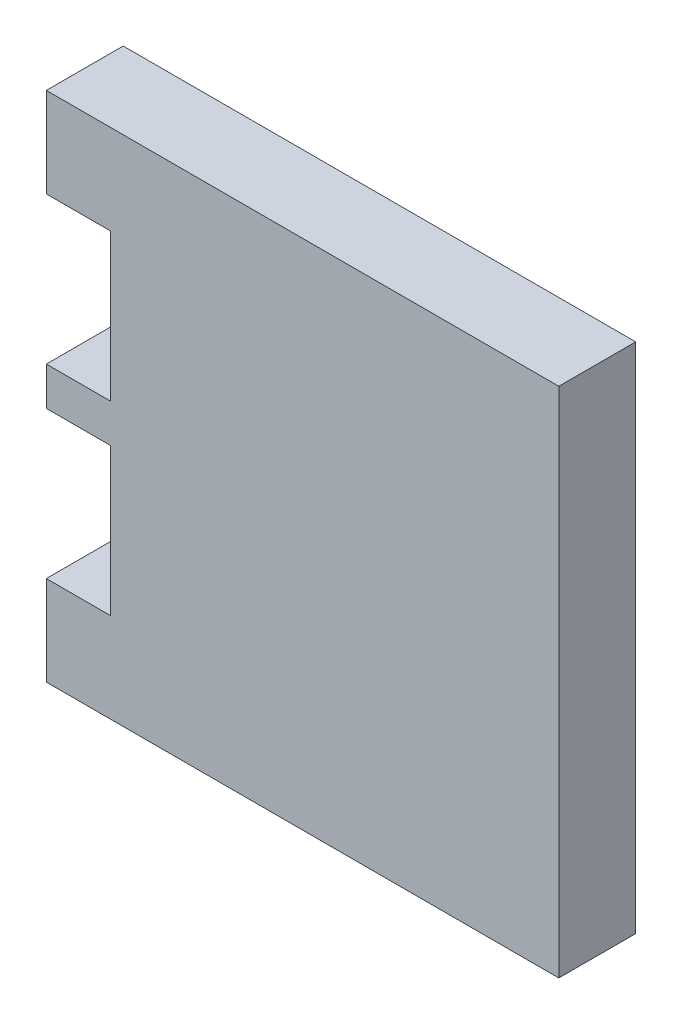
ISO-10303-21;
HEADER;
FILE_DESCRIPTION(('STEP AP214'),'2;1');
FILE_NAME('part.step','',(''),(''),'','','');
FILE_SCHEMA(('AUTOMOTIVE_DESIGN { 1 0 10303 214 1 1 1 1 }'));
ENDSEC;
DATA;
#1=APPLICATION_CONTEXT('core data for automotive mechanical design processes');
#2=APPLICATION_PROTOCOL_DEFINITION('international standard','automotive_design',2000,#1);
#3=PRODUCT_CONTEXT('',#1,'mechanical');
#4=PRODUCT('Part','Part','',(#3));
#5=PRODUCT_RELATED_PRODUCT_CATEGORY('part','',(#4));
#6=PRODUCT_DEFINITION_FORMATION('','',#4);
#7=PRODUCT_DEFINITION_CONTEXT('part definition',#1,'design');
#8=PRODUCT_DEFINITION('design','',#6,#7);
#9=PRODUCT_DEFINITION_SHAPE('','',#8);
#10=(LENGTH_UNIT() NAMED_UNIT(*) SI_UNIT(.MILLI.,.METRE.));
#11=(NAMED_UNIT(*) PLANE_ANGLE_UNIT() SI_UNIT($,.RADIAN.));
#12=(NAMED_UNIT(*) SI_UNIT($,.STERADIAN.) SOLID_ANGLE_UNIT());
#13=UNCERTAINTY_MEASURE_WITH_UNIT(LENGTH_MEASURE(1.E-05),#10,'distance_accuracy_value','');
#14=(GEOMETRIC_REPRESENTATION_CONTEXT(3) GLOBAL_UNCERTAINTY_ASSIGNED_CONTEXT((#13)) GLOBAL_UNIT_ASSIGNED_CONTEXT((#10,
#11,#12)) REPRESENTATION_CONTEXT('',''));
#15=CARTESIAN_POINT('',(0.,0.,0.));
#16=DIRECTION('',(0.,0.,1.));
#17=DIRECTION('',(1.,0.,0.));
#18=AXIS2_PLACEMENT_3D('',#15,#16,#17);
#19=CARTESIAN_POINT('',(-25.7556270096463,-10.1929260450161,6.));
#20=DIRECTION('',(0.,1.,0.));
#21=DIRECTION('',(0.,0.,1.));
#22=AXIS2_PLACEMENT_3D('',#19,#20,#21);
#23=PLANE('',#22);
#24=DIRECTION('',(0.,0.,1.));
#25=VECTOR('',#24,1.);
#26=CARTESIAN_POINT('',(14.2443729903537,-10.1929260450161,0.));
#27=LINE('',#26,#25);
#28=CARTESIAN_POINT('',(14.2443729903537,-10.1929260450161,0.));
#29=VERTEX_POINT('',#28);
#30=CARTESIAN_POINT('',(14.2443729903537,-10.1929260450161,6.));
#31=VERTEX_POINT('',#30);
#32=EDGE_CURVE('E124',#29,#31,#27,.T.);
#33=ORIENTED_EDGE('',*,*,#32,.T.);
#34=DIRECTION('',(1.,0.,0.));
#35=VECTOR('',#34,1.);
#36=CARTESIAN_POINT('',(-25.7556270096463,-10.1929260450161,6.));
#37=LINE('',#36,#35);
#38=CARTESIAN_POINT('',(-25.7556270096463,-10.1929260450161,6.));
#39=VERTEX_POINT('',#38);
#40=EDGE_CURVE('E150',#39,#31,#37,.T.);
#41=ORIENTED_EDGE('',*,*,#40,.F.);
#42=DIRECTION('',(0.,0.,-1.));
#43=VECTOR('',#42,1.);
#44=CARTESIAN_POINT('',(-25.7556270096463,-10.1929260450161,6.));
#45=LINE('',#44,#43);
#46=CARTESIAN_POINT('',(-25.7556270096463,-10.1929260450161,0.));
#47=VERTEX_POINT('',#46);
#48=EDGE_CURVE('E40',#39,#47,#45,.T.);
#49=ORIENTED_EDGE('',*,*,#48,.T.);
#50=DIRECTION('',(1.,0.,0.));
#51=VECTOR('',#50,1.);
#52=CARTESIAN_POINT('',(-25.7556270096463,-10.1929260450161,0.));
#53=LINE('',#52,#51);
#54=EDGE_CURVE('E143',#47,#29,#53,.T.);
#55=ORIENTED_EDGE('',*,*,#54,.T.);
#56=EDGE_LOOP('',(#33,#41,#49,#55));
#57=FACE_BOUND('',#56,.T.);
#58=ADVANCED_FACE('F33',(#57),#23,.F.);
#59=CARTESIAN_POINT('',(0.,0.,6.));
#60=DIRECTION('',(0.,0.,-1.));
#61=DIRECTION('',(-1.,0.,0.));
#62=AXIS2_PLACEMENT_3D('',#59,#60,#61);
#63=PLANE('',#62);
#64=ORIENTED_EDGE('',*,*,#40,.T.);
#65=DIRECTION('',(0.,-1.,0.));
#66=VECTOR('',#65,1.);
#67=CARTESIAN_POINT('',(14.2443729903537,29.8070739549839,6.));
#68=LINE('',#67,#66);
#69=CARTESIAN_POINT('',(14.2443729903537,29.8070739549839,6.));
#70=VERTEX_POINT('',#69);
#71=EDGE_CURVE('E126',#70,#31,#68,.T.);
#72=ORIENTED_EDGE('',*,*,#71,.F.);
#73=DIRECTION('',(1.,0.,0.));
#74=VECTOR('',#73,1.);
#75=CARTESIAN_POINT('',(-25.7556270096463,29.8070739549839,6.));
#76=LINE('',#75,#74);
#77=CARTESIAN_POINT('',(-25.7556270096463,29.8070739549839,6.));
#78=VERTEX_POINT('',#77);
#79=EDGE_CURVE('E134',#78,#70,#76,.T.);
#80=ORIENTED_EDGE('',*,*,#79,.F.);
#81=DIRECTION('',(0.,-1.,0.));
#82=VECTOR('',#81,1.);
#83=CARTESIAN_POINT('',(-25.7556270096463,29.8070739549839,6.));
#84=LINE('',#83,#82);
#85=CARTESIAN_POINT('',(-25.7556270096463,22.8070739549839,6.));
#86=VERTEX_POINT('',#85);
#87=EDGE_CURVE('E152',#78,#86,#84,.T.);
#88=ORIENTED_EDGE('',*,*,#87,.T.);
#89=DIRECTION('',(1.,0.,0.));
#90=VECTOR('',#89,1.);
#91=CARTESIAN_POINT('',(0.,22.8070739549839,6.));
#92=LINE('',#91,#90);
#93=CARTESIAN_POINT('',(-20.7556270096463,22.8070739549839,6.));
#94=VERTEX_POINT('',#93);
#95=EDGE_CURVE('E205',#86,#94,#92,.T.);
#96=ORIENTED_EDGE('',*,*,#95,.T.);
#97=DIRECTION('',(0.,-1.,0.));
#98=VECTOR('',#97,1.);
#99=CARTESIAN_POINT('',(-20.7556270096463,0.,6.));
#100=LINE('',#99,#98);
#101=CARTESIAN_POINT('',(-20.7556270096463,11.3070739549839,6.));
#102=VERTEX_POINT('',#101);
#103=EDGE_CURVE('E177',#94,#102,#100,.T.);
#104=ORIENTED_EDGE('',*,*,#103,.T.);
#105=DIRECTION('',(1.,0.,0.));
#106=VECTOR('',#105,1.);
#107=CARTESIAN_POINT('',(0.,11.3070739549839,6.));
#108=LINE('',#107,#106);
#109=CARTESIAN_POINT('',(-25.7556270096463,11.3070739549839,6.));
#110=VERTEX_POINT('',#109);
#111=EDGE_CURVE('E201',#110,#102,#108,.T.);
#112=ORIENTED_EDGE('',*,*,#111,.F.);
#113=CARTESIAN_POINT('',(-25.7556270096463,8.30707395498392,6.));
#114=VERTEX_POINT('',#113);
#115=EDGE_CURVE('E157',#110,#114,#84,.T.);
#116=ORIENTED_EDGE('',*,*,#115,.T.);
#117=DIRECTION('',(1.,0.,0.));
#118=VECTOR('',#117,1.);
#119=CARTESIAN_POINT('',(0.,8.30707395498392,6.));
#120=LINE('',#119,#118);
#121=CARTESIAN_POINT('',(-20.7556270096463,8.30707395498392,6.));
#122=VERTEX_POINT('',#121);
#123=EDGE_CURVE('E182',#114,#122,#120,.T.);
#124=ORIENTED_EDGE('',*,*,#123,.T.);
#125=DIRECTION('',(0.,-1.,0.));
#126=VECTOR('',#125,1.);
#127=CARTESIAN_POINT('',(-20.7556270096463,0.,6.));
#128=LINE('',#127,#126);
#129=CARTESIAN_POINT('',(-20.7556270096463,-3.19292604501608,6.));
#130=VERTEX_POINT('',#129);
#131=EDGE_CURVE('E135',#122,#130,#128,.T.);
#132=ORIENTED_EDGE('',*,*,#131,.T.);
#133=DIRECTION('',(1.,0.,0.));
#134=VECTOR('',#133,1.);
#135=CARTESIAN_POINT('',(0.,-3.19292604501608,6.));
#136=LINE('',#135,#134);
#137=CARTESIAN_POINT('',(-25.7556270096463,-3.19292604501608,6.));
#138=VERTEX_POINT('',#137);
#139=EDGE_CURVE('E178',#138,#130,#136,.T.);
#140=ORIENTED_EDGE('',*,*,#139,.F.);
#141=EDGE_CURVE('E158',#138,#39,#84,.T.);
#142=ORIENTED_EDGE('',*,*,#141,.T.);
#143=EDGE_LOOP('',(#64,#72,#80,#88,#96,#104,#112,#116,#124,#132,#140,#142));
#144=FACE_BOUND('',#143,.T.);
#145=ADVANCED_FACE('F215',(#144),#63,.F.);
#146=CARTESIAN_POINT('',(0.,0.,0.));
#147=DIRECTION('',(0.,0.,-1.));
#148=DIRECTION('',(-1.,0.,0.));
#149=AXIS2_PLACEMENT_3D('',#146,#147,#148);
#150=PLANE('',#149);
#151=DIRECTION('',(0.,-1.,0.));
#152=VECTOR('',#151,1.);
#153=CARTESIAN_POINT('',(14.2443729903537,29.8070739549839,0.));
#154=LINE('',#153,#152);
#155=CARTESIAN_POINT('',(14.2443729903537,29.8070739549839,0.));
#156=VERTEX_POINT('',#155);
#157=EDGE_CURVE('E47',#156,#29,#154,.T.);
#158=ORIENTED_EDGE('',*,*,#157,.T.);
#159=ORIENTED_EDGE('',*,*,#54,.F.);
#160=DIRECTION('',(0.,-1.,0.));
#161=VECTOR('',#160,1.);
#162=CARTESIAN_POINT('',(-25.7556270096463,29.8070739549839,0.));
#163=LINE('',#162,#161);
#164=CARTESIAN_POINT('',(-25.7556270096463,-3.19292604501608,0.));
#165=VERTEX_POINT('',#164);
#166=EDGE_CURVE('E142',#165,#47,#163,.T.);
#167=ORIENTED_EDGE('',*,*,#166,.F.);
#168=DIRECTION('',(1.,0.,0.));
#169=VECTOR('',#168,1.);
#170=CARTESIAN_POINT('',(0.,-3.19292604501608,0.));
#171=LINE('',#170,#169);
#172=CARTESIAN_POINT('',(-20.7556270096463,-3.19292604501608,0.));
#173=VERTEX_POINT('',#172);
#174=EDGE_CURVE('E171',#165,#173,#171,.T.);
#175=ORIENTED_EDGE('',*,*,#174,.T.);
#176=DIRECTION('',(0.,-1.,0.));
#177=VECTOR('',#176,1.);
#178=CARTESIAN_POINT('',(-20.7556270096463,0.,0.));
#179=LINE('',#178,#177);
#180=CARTESIAN_POINT('',(-20.7556270096463,8.30707395498392,0.));
#181=VERTEX_POINT('',#180);
#182=EDGE_CURVE('E181',#181,#173,#179,.T.);
#183=ORIENTED_EDGE('',*,*,#182,.F.);
#184=DIRECTION('',(1.,0.,0.));
#185=VECTOR('',#184,1.);
#186=CARTESIAN_POINT('',(0.,8.30707395498392,0.));
#187=LINE('',#186,#185);
#188=CARTESIAN_POINT('',(-25.7556270096463,8.30707395498392,0.));
#189=VERTEX_POINT('',#188);
#190=EDGE_CURVE('E189',#189,#181,#187,.T.);
#191=ORIENTED_EDGE('',*,*,#190,.F.);
#192=CARTESIAN_POINT('',(-25.7556270096463,11.3070739549839,0.));
#193=VERTEX_POINT('',#192);
#194=EDGE_CURVE('E145',#193,#189,#163,.T.);
#195=ORIENTED_EDGE('',*,*,#194,.F.);
#196=DIRECTION('',(1.,0.,0.));
#197=VECTOR('',#196,1.);
#198=CARTESIAN_POINT('',(0.,11.3070739549839,0.));
#199=LINE('',#198,#197);
#200=CARTESIAN_POINT('',(-20.7556270096463,11.3070739549839,0.));
#201=VERTEX_POINT('',#200);
#202=EDGE_CURVE('E195',#193,#201,#199,.T.);
#203=ORIENTED_EDGE('',*,*,#202,.T.);
#204=DIRECTION('',(0.,-1.,0.));
#205=VECTOR('',#204,1.);
#206=CARTESIAN_POINT('',(-20.7556270096463,0.,0.));
#207=LINE('',#206,#205);
#208=CARTESIAN_POINT('',(-20.7556270096463,22.8070739549839,0.));
#209=VERTEX_POINT('',#208);
#210=EDGE_CURVE('E204',#209,#201,#207,.T.);
#211=ORIENTED_EDGE('',*,*,#210,.F.);
#212=DIRECTION('',(1.,0.,0.));
#213=VECTOR('',#212,1.);
#214=CARTESIAN_POINT('',(0.,22.8070739549839,0.));
#215=LINE('',#214,#213);
#216=CARTESIAN_POINT('',(-25.7556270096463,22.8070739549839,0.));
#217=VERTEX_POINT('',#216);
#218=EDGE_CURVE('E211',#217,#209,#215,.T.);
#219=ORIENTED_EDGE('',*,*,#218,.F.);
#220=CARTESIAN_POINT('',(-25.7556270096463,29.8070739549839,0.));
#221=VERTEX_POINT('',#220);
#222=EDGE_CURVE('E141',#221,#217,#163,.T.);
#223=ORIENTED_EDGE('',*,*,#222,.F.);
#224=DIRECTION('',(1.,0.,0.));
#225=VECTOR('',#224,1.);
#226=CARTESIAN_POINT('',(-25.7556270096463,29.8070739549839,0.));
#227=LINE('',#226,#225);
#228=EDGE_CURVE('E132',#221,#156,#227,.T.);
#229=ORIENTED_EDGE('',*,*,#228,.T.);
#230=EDGE_LOOP('',(#158,#159,#167,#175,#183,#191,#195,#203,#211,#219,#223,#229));
#231=FACE_BOUND('',#230,.T.);
#232=ADVANCED_FACE('F138',(#231),#150,.T.);
#233=CARTESIAN_POINT('',(-25.7556270096463,29.8070739549839,6.));
#234=DIRECTION('',(1.,0.,0.));
#235=DIRECTION('',(0.,0.,-1.));
#236=AXIS2_PLACEMENT_3D('',#233,#234,#235);
#237=PLANE('',#236);
#238=DIRECTION('',(0.,0.,1.));
#239=VECTOR('',#238,1.);
#240=CARTESIAN_POINT('',(-25.7556270096463,22.8070739549839,0.));
#241=LINE('',#240,#239);
#242=EDGE_CURVE('E194',#217,#86,#241,.T.);
#243=ORIENTED_EDGE('',*,*,#242,.T.);
#244=ORIENTED_EDGE('',*,*,#87,.F.);
#245=DIRECTION('',(0.,0.,-1.));
#246=VECTOR('',#245,1.);
#247=CARTESIAN_POINT('',(-25.7556270096463,29.8070739549839,6.));
#248=LINE('',#247,#246);
#249=EDGE_CURVE('E11',#78,#221,#248,.T.);
#250=ORIENTED_EDGE('',*,*,#249,.T.);
#251=ORIENTED_EDGE('',*,*,#222,.T.);
#252=EDGE_LOOP('',(#243,#244,#250,#251));
#253=FACE_BOUND('',#252,.T.);
#254=ADVANCED_FACE('F222',(#253),#237,.F.);
#255=ORIENTED_EDGE('',*,*,#115,.F.);
#256=DIRECTION('',(0.,0.,1.));
#257=VECTOR('',#256,1.);
#258=CARTESIAN_POINT('',(-25.7556270096463,11.3070739549839,0.));
#259=LINE('',#258,#257);
#260=EDGE_CURVE('E198',#193,#110,#259,.T.);
#261=ORIENTED_EDGE('',*,*,#260,.F.);
#262=ORIENTED_EDGE('',*,*,#194,.T.);
#263=DIRECTION('',(0.,0.,1.));
#264=VECTOR('',#263,1.);
#265=CARTESIAN_POINT('',(-25.7556270096463,8.30707395498392,0.));
#266=LINE('',#265,#264);
#267=EDGE_CURVE('E55',#189,#114,#266,.T.);
#268=ORIENTED_EDGE('',*,*,#267,.T.);
#269=EDGE_LOOP('',(#255,#261,#262,#268));
#270=FACE_BOUND('',#269,.T.);
#271=ADVANCED_FACE('F231',(#270),#237,.F.);
#272=CARTESIAN_POINT('',(-25.7556270096463,29.8070739549839,6.));
#273=DIRECTION('',(0.,1.,0.));
#274=DIRECTION('',(0.,0.,1.));
#275=AXIS2_PLACEMENT_3D('',#272,#273,#274);
#276=PLANE('',#275);
#277=DIRECTION('',(0.,0.,1.));
#278=VECTOR('',#277,1.);
#279=CARTESIAN_POINT('',(14.2443729903537,29.8070739549839,0.));
#280=LINE('',#279,#278);
#281=EDGE_CURVE('E121',#156,#70,#280,.T.);
#282=ORIENTED_EDGE('',*,*,#281,.F.);
#283=ORIENTED_EDGE('',*,*,#228,.F.);
#284=ORIENTED_EDGE('',*,*,#249,.F.);
#285=ORIENTED_EDGE('',*,*,#79,.T.);
#286=EDGE_LOOP('',(#282,#283,#284,#285));
#287=FACE_BOUND('',#286,.T.);
#288=ADVANCED_FACE('F131',(#287),#276,.T.);
#289=ORIENTED_EDGE('',*,*,#141,.F.);
#290=DIRECTION('',(0.,0.,1.));
#291=VECTOR('',#290,1.);
#292=CARTESIAN_POINT('',(-25.7556270096463,-3.19292604501608,0.));
#293=LINE('',#292,#291);
#294=EDGE_CURVE('E173',#165,#138,#293,.T.);
#295=ORIENTED_EDGE('',*,*,#294,.F.);
#296=ORIENTED_EDGE('',*,*,#166,.T.);
#297=ORIENTED_EDGE('',*,*,#48,.F.);
#298=EDGE_LOOP('',(#289,#295,#296,#297));
#299=FACE_BOUND('',#298,.T.);
#300=ADVANCED_FACE('F228',(#299),#237,.F.);
#301=CARTESIAN_POINT('',(-20.7556270096463,0.,0.));
#302=DIRECTION('',(-1.,0.,0.));
#303=DIRECTION('',(0.,0.,1.));
#304=AXIS2_PLACEMENT_3D('',#301,#302,#303);
#305=PLANE('',#304);
#306=ORIENTED_EDGE('',*,*,#131,.F.);
#307=DIRECTION('',(0.,0.,1.));
#308=VECTOR('',#307,1.);
#309=CARTESIAN_POINT('',(-20.7556270096463,8.30707395498392,0.));
#310=LINE('',#309,#308);
#311=EDGE_CURVE('E169',#181,#122,#310,.T.);
#312=ORIENTED_EDGE('',*,*,#311,.F.);
#313=ORIENTED_EDGE('',*,*,#182,.T.);
#314=DIRECTION('',(0.,0.,1.));
#315=VECTOR('',#314,1.);
#316=CARTESIAN_POINT('',(-20.7556270096463,-3.19292604501608,0.));
#317=LINE('',#316,#315);
#318=EDGE_CURVE('E175',#173,#130,#317,.T.);
#319=ORIENTED_EDGE('',*,*,#318,.T.);
#320=EDGE_LOOP('',(#306,#312,#313,#319));
#321=FACE_BOUND('',#320,.T.);
#322=ADVANCED_FACE('F225',(#321),#305,.T.);
#323=CARTESIAN_POINT('',(0.,-3.19292604501608,0.));
#324=DIRECTION('',(0.,-1.,0.));
#325=DIRECTION('',(0.,0.,-1.));
#326=AXIS2_PLACEMENT_3D('',#323,#324,#325);
#327=PLANE('',#326);
#328=ORIENTED_EDGE('',*,*,#139,.T.);
#329=ORIENTED_EDGE('',*,*,#318,.F.);
#330=ORIENTED_EDGE('',*,*,#174,.F.);
#331=ORIENTED_EDGE('',*,*,#294,.T.);
#332=EDGE_LOOP('',(#328,#329,#330,#331));
#333=FACE_BOUND('',#332,.T.);
#334=ADVANCED_FACE('F260',(#333),#327,.F.);
#335=CARTESIAN_POINT('',(0.,8.30707395498392,0.));
#336=DIRECTION('',(0.,-1.,0.));
#337=DIRECTION('',(0.,0.,-1.));
#338=AXIS2_PLACEMENT_3D('',#335,#336,#337);
#339=PLANE('',#338);
#340=ORIENTED_EDGE('',*,*,#123,.F.);
#341=ORIENTED_EDGE('',*,*,#267,.F.);
#342=ORIENTED_EDGE('',*,*,#190,.T.);
#343=ORIENTED_EDGE('',*,*,#311,.T.);
#344=EDGE_LOOP('',(#340,#341,#342,#343));
#345=FACE_BOUND('',#344,.T.);
#346=ADVANCED_FACE('F253',(#345),#339,.T.);
#347=CARTESIAN_POINT('',(-20.7556270096463,0.,0.));
#348=DIRECTION('',(-1.,0.,0.));
#349=DIRECTION('',(0.,0.,1.));
#350=AXIS2_PLACEMENT_3D('',#347,#348,#349);
#351=PLANE('',#350);
#352=ORIENTED_EDGE('',*,*,#103,.F.);
#353=DIRECTION('',(0.,0.,1.));
#354=VECTOR('',#353,1.);
#355=CARTESIAN_POINT('',(-20.7556270096463,22.8070739549839,0.));
#356=LINE('',#355,#354);
#357=EDGE_CURVE('E192',#209,#94,#356,.T.);
#358=ORIENTED_EDGE('',*,*,#357,.F.);
#359=ORIENTED_EDGE('',*,*,#210,.T.);
#360=DIRECTION('',(0.,0.,1.));
#361=VECTOR('',#360,1.);
#362=CARTESIAN_POINT('',(-20.7556270096463,11.3070739549839,0.));
#363=LINE('',#362,#361);
#364=EDGE_CURVE('E147',#201,#102,#363,.T.);
#365=ORIENTED_EDGE('',*,*,#364,.T.);
#366=EDGE_LOOP('',(#352,#358,#359,#365));
#367=FACE_BOUND('',#366,.T.);
#368=ADVANCED_FACE('F267',(#367),#351,.T.);
#369=CARTESIAN_POINT('',(0.,11.3070739549839,0.));
#370=DIRECTION('',(0.,-1.,0.));
#371=DIRECTION('',(0.,0.,-1.));
#372=AXIS2_PLACEMENT_3D('',#369,#370,#371);
#373=PLANE('',#372);
#374=ORIENTED_EDGE('',*,*,#111,.T.);
#375=ORIENTED_EDGE('',*,*,#364,.F.);
#376=ORIENTED_EDGE('',*,*,#202,.F.);
#377=ORIENTED_EDGE('',*,*,#260,.T.);
#378=EDGE_LOOP('',(#374,#375,#376,#377));
#379=FACE_BOUND('',#378,.T.);
#380=ADVANCED_FACE('F249',(#379),#373,.F.);
#381=CARTESIAN_POINT('',(0.,22.8070739549839,0.));
#382=DIRECTION('',(0.,-1.,0.));
#383=DIRECTION('',(0.,0.,-1.));
#384=AXIS2_PLACEMENT_3D('',#381,#382,#383);
#385=PLANE('',#384);
#386=ORIENTED_EDGE('',*,*,#95,.F.);
#387=ORIENTED_EDGE('',*,*,#242,.F.);
#388=ORIENTED_EDGE('',*,*,#218,.T.);
#389=ORIENTED_EDGE('',*,*,#357,.T.);
#390=EDGE_LOOP('',(#386,#387,#388,#389));
#391=FACE_BOUND('',#390,.T.);
#392=ADVANCED_FACE('F272',(#391),#385,.T.);
#393=CARTESIAN_POINT('',(14.2443729903537,29.8070739549839,0.));
#394=DIRECTION('',(-1.,0.,0.));
#395=DIRECTION('',(0.,0.,1.));
#396=AXIS2_PLACEMENT_3D('',#393,#394,#395);
#397=PLANE('',#396);
#398=ORIENTED_EDGE('',*,*,#71,.T.);
#399=ORIENTED_EDGE('',*,*,#32,.F.);
#400=ORIENTED_EDGE('',*,*,#157,.F.);
#401=ORIENTED_EDGE('',*,*,#281,.T.);
#402=EDGE_LOOP('',(#398,#399,#400,#401));
#403=FACE_BOUND('',#402,.T.);
#404=ADVANCED_FACE('F120',(#403),#397,.F.);
#405=CLOSED_SHELL('',(#58,#145,#232,#254,#271,#288,#300,#322,#334,#346,#368,#380,#392,#404));
#406=MANIFOLD_SOLID_BREP('B2',#405);
#407=ADVANCED_BREP_SHAPE_REPRESENTATION('',(#18,#406),#14);
#408=SHAPE_DEFINITION_REPRESENTATION(#9,#407);
ENDSEC;
END-ISO-10303-21;
